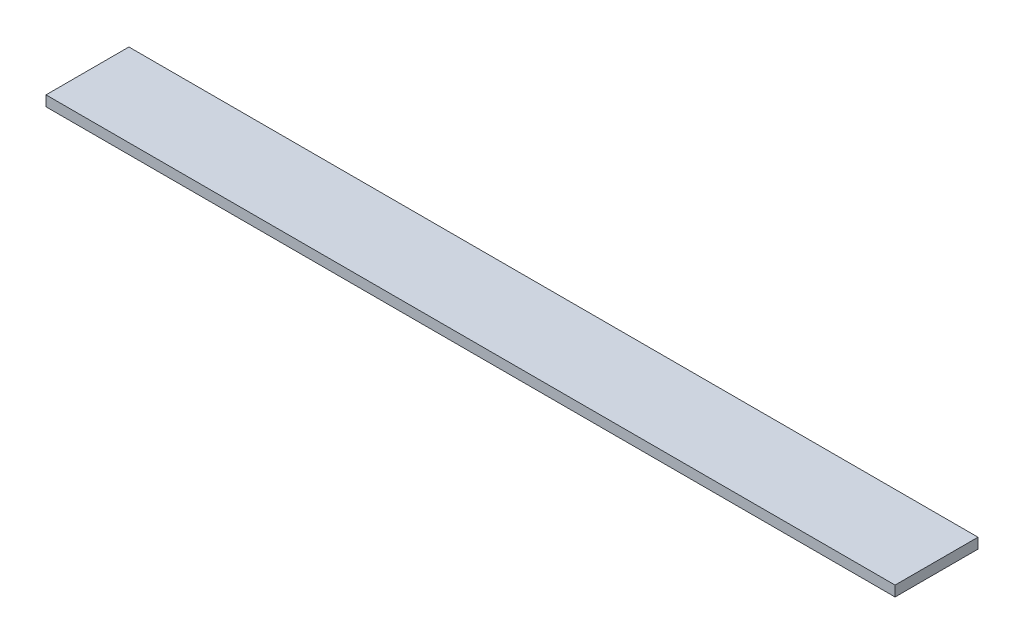
ISO-10303-21;
HEADER;
FILE_DESCRIPTION(('STEP AP214'),'2;1');
FILE_NAME('part.step','',(''),(''),'','','');
FILE_SCHEMA(('AUTOMOTIVE_DESIGN { 1 0 10303 214 1 1 1 1 }'));
ENDSEC;
DATA;
#1=APPLICATION_CONTEXT('core data for automotive mechanical design processes');
#2=APPLICATION_PROTOCOL_DEFINITION('international standard','automotive_design',2000,#1);
#3=PRODUCT_CONTEXT('',#1,'mechanical');
#4=PRODUCT('Part','Part','',(#3));
#5=PRODUCT_RELATED_PRODUCT_CATEGORY('part','',(#4));
#6=PRODUCT_DEFINITION_FORMATION('','',#4);
#7=PRODUCT_DEFINITION_CONTEXT('part definition',#1,'design');
#8=PRODUCT_DEFINITION('design','',#6,#7);
#9=PRODUCT_DEFINITION_SHAPE('','',#8);
#10=(LENGTH_UNIT() NAMED_UNIT(*) SI_UNIT(.MILLI.,.METRE.));
#11=(NAMED_UNIT(*) PLANE_ANGLE_UNIT() SI_UNIT($,.RADIAN.));
#12=(NAMED_UNIT(*) SI_UNIT($,.STERADIAN.) SOLID_ANGLE_UNIT());
#13=UNCERTAINTY_MEASURE_WITH_UNIT(LENGTH_MEASURE(1.E-05),#10,'distance_accuracy_value','');
#14=(GEOMETRIC_REPRESENTATION_CONTEXT(3) GLOBAL_UNCERTAINTY_ASSIGNED_CONTEXT((#13)) GLOBAL_UNIT_ASSIGNED_CONTEXT((#10,
#11,#12)) REPRESENTATION_CONTEXT('',''));
#15=CARTESIAN_POINT('',(0.,0.,0.));
#16=DIRECTION('',(0.,0.,1.));
#17=DIRECTION('',(1.,0.,0.));
#18=AXIS2_PLACEMENT_3D('',#15,#16,#17);
#19=CARTESIAN_POINT('',(0.,3.175,0.));
#20=DIRECTION('',(1.,0.,0.));
#21=DIRECTION('',(0.,0.,-1.));
#22=AXIS2_PLACEMENT_3D('',#19,#20,#21);
#23=PLANE('',#22);
#24=DIRECTION('',(0.,0.,1.));
#25=VECTOR('',#24,1.);
#26=CARTESIAN_POINT('',(0.,0.,0.));
#27=LINE('',#26,#25);
#28=CARTESIAN_POINT('',(0.,0.,-25.4));
#29=VERTEX_POINT('',#28);
#30=CARTESIAN_POINT('',(0.,0.,0.));
#31=VERTEX_POINT('',#30);
#32=EDGE_CURVE('E100',#29,#31,#27,.T.);
#33=ORIENTED_EDGE('',*,*,#32,.T.);
#34=DIRECTION('',(0.,-1.,0.));
#35=VECTOR('',#34,1.);
#36=CARTESIAN_POINT('',(0.,3.175,0.));
#37=LINE('',#36,#35);
#38=CARTESIAN_POINT('',(0.,3.175,0.));
#39=VERTEX_POINT('',#38);
#40=EDGE_CURVE('E11',#39,#31,#37,.T.);
#41=ORIENTED_EDGE('',*,*,#40,.F.);
#42=DIRECTION('',(0.,0.,1.));
#43=VECTOR('',#42,1.);
#44=CARTESIAN_POINT('',(0.,3.175,0.));
#45=LINE('',#44,#43);
#46=CARTESIAN_POINT('',(0.,3.175,-25.4));
#47=VERTEX_POINT('',#46);
#48=EDGE_CURVE('E88',#47,#39,#45,.T.);
#49=ORIENTED_EDGE('',*,*,#48,.F.);
#50=DIRECTION('',(0.,-1.,0.));
#51=VECTOR('',#50,1.);
#52=CARTESIAN_POINT('',(0.,3.175,-25.4));
#53=LINE('',#52,#51);
#54=EDGE_CURVE('E96',#47,#29,#53,.T.);
#55=ORIENTED_EDGE('',*,*,#54,.T.);
#56=EDGE_LOOP('',(#33,#41,#49,#55));
#57=FACE_BOUND('',#56,.T.);
#58=ADVANCED_FACE('F37',(#57),#23,.F.);
#59=CARTESIAN_POINT('',(0.,3.175,0.));
#60=DIRECTION('',(0.,0.,-1.));
#61=DIRECTION('',(-1.,0.,0.));
#62=AXIS2_PLACEMENT_3D('',#59,#60,#61);
#63=PLANE('',#62);
#64=DIRECTION('',(1.,0.,0.));
#65=VECTOR('',#64,1.);
#66=CARTESIAN_POINT('',(0.,0.,0.));
#67=LINE('',#66,#65);
#68=CARTESIAN_POINT('',(260.096,0.,0.));
#69=VERTEX_POINT('',#68);
#70=EDGE_CURVE('E92',#31,#69,#67,.T.);
#71=ORIENTED_EDGE('',*,*,#70,.T.);
#72=DIRECTION('',(0.,-1.,0.));
#73=VECTOR('',#72,1.);
#74=CARTESIAN_POINT('',(260.096,3.175,0.));
#75=LINE('',#74,#73);
#76=CARTESIAN_POINT('',(260.096,3.175,0.));
#77=VERTEX_POINT('',#76);
#78=EDGE_CURVE('E45',#77,#69,#75,.T.);
#79=ORIENTED_EDGE('',*,*,#78,.F.);
#80=DIRECTION('',(1.,0.,0.));
#81=VECTOR('',#80,1.);
#82=CARTESIAN_POINT('',(0.,3.175,0.));
#83=LINE('',#82,#81);
#84=EDGE_CURVE('E83',#39,#77,#83,.T.);
#85=ORIENTED_EDGE('',*,*,#84,.F.);
#86=ORIENTED_EDGE('',*,*,#40,.T.);
#87=EDGE_LOOP('',(#71,#79,#85,#86));
#88=FACE_BOUND('',#87,.T.);
#89=ADVANCED_FACE('F91',(#88),#63,.F.);
#90=CARTESIAN_POINT('',(260.096,3.175,0.));
#91=DIRECTION('',(-1.,0.,0.));
#92=DIRECTION('',(0.,0.,1.));
#93=AXIS2_PLACEMENT_3D('',#90,#91,#92);
#94=PLANE('',#93);
#95=DIRECTION('',(0.,0.,-1.));
#96=VECTOR('',#95,1.);
#97=CARTESIAN_POINT('',(260.096,0.,0.));
#98=LINE('',#97,#96);
#99=CARTESIAN_POINT('',(260.096,0.,-25.4));
#100=VERTEX_POINT('',#99);
#101=EDGE_CURVE('E70',#69,#100,#98,.T.);
#102=ORIENTED_EDGE('',*,*,#101,.T.);
#103=DIRECTION('',(0.,-1.,0.));
#104=VECTOR('',#103,1.);
#105=CARTESIAN_POINT('',(260.096,3.175,-25.4));
#106=LINE('',#105,#104);
#107=CARTESIAN_POINT('',(260.096,3.175,-25.4));
#108=VERTEX_POINT('',#107);
#109=EDGE_CURVE('E93',#108,#100,#106,.T.);
#110=ORIENTED_EDGE('',*,*,#109,.F.);
#111=DIRECTION('',(0.,0.,-1.));
#112=VECTOR('',#111,1.);
#113=CARTESIAN_POINT('',(260.096,3.175,0.));
#114=LINE('',#113,#112);
#115=EDGE_CURVE('E86',#77,#108,#114,.T.);
#116=ORIENTED_EDGE('',*,*,#115,.F.);
#117=ORIENTED_EDGE('',*,*,#78,.T.);
#118=EDGE_LOOP('',(#102,#110,#116,#117));
#119=FACE_BOUND('',#118,.T.);
#120=ADVANCED_FACE('F94',(#119),#94,.F.);
#121=CARTESIAN_POINT('',(0.,3.175,-25.4));
#122=DIRECTION('',(0.,0.,1.));
#123=DIRECTION('',(1.,0.,0.));
#124=AXIS2_PLACEMENT_3D('',#121,#122,#123);
#125=PLANE('',#124);
#126=DIRECTION('',(-1.,0.,0.));
#127=VECTOR('',#126,1.);
#128=CARTESIAN_POINT('',(0.,0.,-25.4));
#129=LINE('',#128,#127);
#130=EDGE_CURVE('E76',#100,#29,#129,.T.);
#131=ORIENTED_EDGE('',*,*,#130,.T.);
#132=ORIENTED_EDGE('',*,*,#54,.F.);
#133=DIRECTION('',(-1.,0.,0.));
#134=VECTOR('',#133,1.);
#135=CARTESIAN_POINT('',(0.,3.175,-25.4));
#136=LINE('',#135,#134);
#137=EDGE_CURVE('E53',#108,#47,#136,.T.);
#138=ORIENTED_EDGE('',*,*,#137,.F.);
#139=ORIENTED_EDGE('',*,*,#109,.T.);
#140=EDGE_LOOP('',(#131,#132,#138,#139));
#141=FACE_BOUND('',#140,.T.);
#142=ADVANCED_FACE('F107',(#141),#125,.F.);
#143=CARTESIAN_POINT('',(0.,3.175,0.));
#144=DIRECTION('',(0.,-1.,0.));
#145=DIRECTION('',(0.,0.,-1.));
#146=AXIS2_PLACEMENT_3D('',#143,#144,#145);
#147=PLANE('',#146);
#148=ORIENTED_EDGE('',*,*,#48,.T.);
#149=ORIENTED_EDGE('',*,*,#84,.T.);
#150=ORIENTED_EDGE('',*,*,#115,.T.);
#151=ORIENTED_EDGE('',*,*,#137,.T.);
#152=EDGE_LOOP('',(#148,#149,#150,#151));
#153=FACE_BOUND('',#152,.T.);
#154=ADVANCED_FACE('F84',(#153),#147,.F.);
#155=CARTESIAN_POINT('',(0.,0.,0.));
#156=DIRECTION('',(0.,-1.,0.));
#157=DIRECTION('',(0.,0.,-1.));
#158=AXIS2_PLACEMENT_3D('',#155,#156,#157);
#159=PLANE('',#158);
#160=ORIENTED_EDGE('',*,*,#32,.F.);
#161=ORIENTED_EDGE('',*,*,#130,.F.);
#162=ORIENTED_EDGE('',*,*,#101,.F.);
#163=ORIENTED_EDGE('',*,*,#70,.F.);
#164=EDGE_LOOP('',(#160,#161,#162,#163));
#165=FACE_BOUND('',#164,.T.);
#166=ADVANCED_FACE('F110',(#165),#159,.T.);
#167=CLOSED_SHELL('',(#58,#89,#120,#142,#154,#166));
#168=MANIFOLD_SOLID_BREP('B2',#167);
#169=ADVANCED_BREP_SHAPE_REPRESENTATION('',(#18,#168),#14);
#170=SHAPE_DEFINITION_REPRESENTATION(#9,#169);
ENDSEC;
END-ISO-10303-21;
